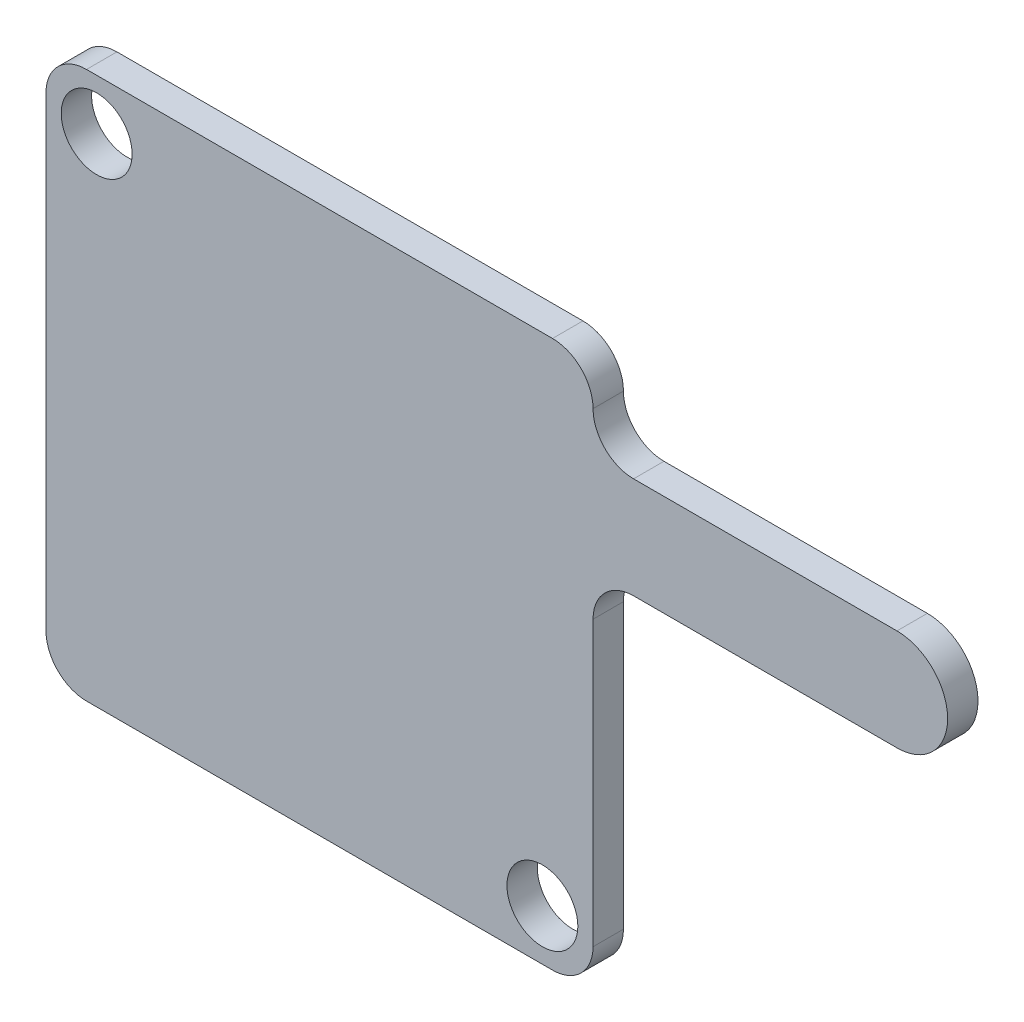
ISO-10303-21;
HEADER;
FILE_DESCRIPTION(('STEP AP214'),'2;1');
FILE_NAME('part.step','',(''),(''),'','','');
FILE_SCHEMA(('AUTOMOTIVE_DESIGN { 1 0 10303 214 1 1 1 1 }'));
ENDSEC;
DATA;
#1=APPLICATION_CONTEXT('core data for automotive mechanical design processes');
#2=APPLICATION_PROTOCOL_DEFINITION('international standard','automotive_design',2000,#1);
#3=PRODUCT_CONTEXT('',#1,'mechanical');
#4=PRODUCT('Part','Part','',(#3));
#5=PRODUCT_RELATED_PRODUCT_CATEGORY('part','',(#4));
#6=PRODUCT_DEFINITION_FORMATION('','',#4);
#7=PRODUCT_DEFINITION_CONTEXT('part definition',#1,'design');
#8=PRODUCT_DEFINITION('design','',#6,#7);
#9=PRODUCT_DEFINITION_SHAPE('','',#8);
#10=(LENGTH_UNIT() NAMED_UNIT(*) SI_UNIT(.MILLI.,.METRE.));
#11=(NAMED_UNIT(*) PLANE_ANGLE_UNIT() SI_UNIT($,.RADIAN.));
#12=(NAMED_UNIT(*) SI_UNIT($,.STERADIAN.) SOLID_ANGLE_UNIT());
#13=UNCERTAINTY_MEASURE_WITH_UNIT(LENGTH_MEASURE(1.E-05),#10,'distance_accuracy_value','');
#14=(GEOMETRIC_REPRESENTATION_CONTEXT(3) GLOBAL_UNCERTAINTY_ASSIGNED_CONTEXT((#13)) GLOBAL_UNIT_ASSIGNED_CONTEXT((#10,
#11,#12)) REPRESENTATION_CONTEXT('',''));
#15=CARTESIAN_POINT('',(0.,0.,0.));
#16=DIRECTION('',(0.,0.,1.));
#17=DIRECTION('',(1.,0.,0.));
#18=AXIS2_PLACEMENT_3D('',#15,#16,#17);
#19=CARTESIAN_POINT('',(42.,20.5,1.5));
#20=DIRECTION('',(0.,0.,-1.));
#21=DIRECTION('',(-1.,0.,0.));
#22=AXIS2_PLACEMENT_3D('',#19,#20,#21);
#23=PLANE('',#22);
#24=CARTESIAN_POINT('',(2.5,24.5,1.5));
#25=DIRECTION('',(0.,0.,1.));
#26=DIRECTION('',(1.,0.,0.));
#27=AXIS2_PLACEMENT_3D('',#24,#25,#26);
#28=CIRCLE('',#27,1.75);
#29=CARTESIAN_POINT('',(4.25,24.5,1.5));
#30=VERTEX_POINT('',#29);
#31=EDGE_CURVE('E163',#30,#30,#28,.T.);
#32=ORIENTED_EDGE('',*,*,#31,.F.);
#33=EDGE_LOOP('',(#32));
#34=FACE_BOUND('',#33,.T.);
#35=DIRECTION('',(0.,-1.,0.));
#36=VECTOR('',#35,1.);
#37=CARTESIAN_POINT('',(0.,0.,1.5));
#38=LINE('',#37,#36);
#39=CARTESIAN_POINT('',(0.,25.,1.5));
#40=VERTEX_POINT('',#39);
#41=CARTESIAN_POINT('',(0.,2.,1.5));
#42=VERTEX_POINT('',#41);
#43=EDGE_CURVE('E241',#40,#42,#38,.T.);
#44=ORIENTED_EDGE('',*,*,#43,.T.);
#45=CARTESIAN_POINT('',(2.,2.,1.5));
#46=DIRECTION('',(0.,0.,-1.));
#47=DIRECTION('',(-1.,0.,0.));
#48=AXIS2_PLACEMENT_3D('',#45,#46,#47);
#49=CIRCLE('',#48,2.);
#50=CARTESIAN_POINT('',(2.,0.,1.5));
#51=VERTEX_POINT('',#50);
#52=EDGE_CURVE('E202',#42,#51,#49,.F.);
#53=ORIENTED_EDGE('',*,*,#52,.T.);
#54=DIRECTION('',(1.,0.,0.));
#55=VECTOR('',#54,1.);
#56=CARTESIAN_POINT('',(0.,0.,1.5));
#57=LINE('',#56,#55);
#58=CARTESIAN_POINT('',(25.,0.,1.5));
#59=VERTEX_POINT('',#58);
#60=EDGE_CURVE('E258',#51,#59,#57,.T.);
#61=ORIENTED_EDGE('',*,*,#60,.T.);
#62=CARTESIAN_POINT('',(25.,2.,1.5));
#63=DIRECTION('',(0.,0.,-1.));
#64=DIRECTION('',(-1.,0.,0.));
#65=AXIS2_PLACEMENT_3D('',#62,#63,#64);
#66=CIRCLE('',#65,2.);
#67=CARTESIAN_POINT('',(27.,2.,1.5));
#68=VERTEX_POINT('',#67);
#69=EDGE_CURVE('E200',#59,#68,#66,.F.);
#70=ORIENTED_EDGE('',*,*,#69,.T.);
#71=DIRECTION('',(0.,1.,0.));
#72=VECTOR('',#71,1.);
#73=CARTESIAN_POINT('',(27.,0.,1.5));
#74=LINE('',#73,#72);
#75=CARTESIAN_POINT('',(27.,16.,1.5));
#76=VERTEX_POINT('',#75);
#77=EDGE_CURVE('E140',#68,#76,#74,.T.);
#78=ORIENTED_EDGE('',*,*,#77,.T.);
#79=CARTESIAN_POINT('',(29.,16.,1.5));
#80=DIRECTION('',(0.,0.,-1.));
#81=DIRECTION('',(-1.,0.,0.));
#82=AXIS2_PLACEMENT_3D('',#79,#80,#81);
#83=CIRCLE('',#82,2.);
#84=CARTESIAN_POINT('',(29.,18.,1.5));
#85=VERTEX_POINT('',#84);
#86=EDGE_CURVE('E59',#76,#85,#83,.T.);
#87=ORIENTED_EDGE('',*,*,#86,.T.);
#88=DIRECTION('',(1.,0.,0.));
#89=VECTOR('',#88,1.);
#90=CARTESIAN_POINT('',(42.,18.,1.5));
#91=LINE('',#90,#89);
#92=CARTESIAN_POINT('',(42.,18.,1.5));
#93=VERTEX_POINT('',#92);
#94=EDGE_CURVE('E130',#85,#93,#91,.T.);
#95=ORIENTED_EDGE('',*,*,#94,.T.);
#96=CARTESIAN_POINT('',(42.,20.5,1.5));
#97=DIRECTION('',(0.,0.,1.));
#98=DIRECTION('',(-1.,0.,0.));
#99=AXIS2_PLACEMENT_3D('',#96,#97,#98);
#100=CIRCLE('',#99,2.5);
#101=CARTESIAN_POINT('',(42.,23.,1.5));
#102=VERTEX_POINT('',#101);
#103=EDGE_CURVE('E135',#93,#102,#100,.T.);
#104=ORIENTED_EDGE('',*,*,#103,.T.);
#105=DIRECTION('',(-1.,0.,0.));
#106=VECTOR('',#105,1.);
#107=CARTESIAN_POINT('',(27.,23.,1.5));
#108=LINE('',#107,#106);
#109=CARTESIAN_POINT('',(29.,23.,1.5));
#110=VERTEX_POINT('',#109);
#111=EDGE_CURVE('E154',#102,#110,#108,.T.);
#112=ORIENTED_EDGE('',*,*,#111,.T.);
#113=CARTESIAN_POINT('',(29.,25.,1.5));
#114=DIRECTION('',(0.,0.,-1.));
#115=DIRECTION('',(-1.,0.,0.));
#116=AXIS2_PLACEMENT_3D('',#113,#114,#115);
#117=CIRCLE('',#116,2.);
#118=CARTESIAN_POINT('',(27.,25.,1.5));
#119=VERTEX_POINT('',#118);
#120=EDGE_CURVE('E11',#110,#119,#117,.T.);
#121=ORIENTED_EDGE('',*,*,#120,.T.);
#122=CARTESIAN_POINT('',(25.,25.,1.5));
#123=DIRECTION('',(0.,0.,-1.));
#124=DIRECTION('',(-1.,0.,0.));
#125=AXIS2_PLACEMENT_3D('',#122,#123,#124);
#126=CIRCLE('',#125,2.);
#127=CARTESIAN_POINT('',(25.,27.,1.5));
#128=VERTEX_POINT('',#127);
#129=EDGE_CURVE('E196',#119,#128,#126,.F.);
#130=ORIENTED_EDGE('',*,*,#129,.T.);
#131=DIRECTION('',(-1.,0.,0.));
#132=VECTOR('',#131,1.);
#133=CARTESIAN_POINT('',(0.,27.,1.5));
#134=LINE('',#133,#132);
#135=CARTESIAN_POINT('',(2.,27.,1.5));
#136=VERTEX_POINT('',#135);
#137=EDGE_CURVE('E177',#128,#136,#134,.T.);
#138=ORIENTED_EDGE('',*,*,#137,.T.);
#139=CARTESIAN_POINT('',(2.,25.,1.5));
#140=DIRECTION('',(0.,0.,-1.));
#141=DIRECTION('',(-1.,0.,0.));
#142=AXIS2_PLACEMENT_3D('',#139,#140,#141);
#143=CIRCLE('',#142,2.);
#144=EDGE_CURVE('E198',#136,#40,#143,.F.);
#145=ORIENTED_EDGE('',*,*,#144,.T.);
#146=EDGE_LOOP('',(#44,#53,#61,#70,#78,#87,#95,#104,#112,#121,#130,#138,#145));
#147=FACE_BOUND('',#146,.T.);
#148=CARTESIAN_POINT('',(24.5,2.5,1.5));
#149=DIRECTION('',(0.,0.,1.));
#150=DIRECTION('',(1.,0.,0.));
#151=AXIS2_PLACEMENT_3D('',#148,#149,#150);
#152=CIRCLE('',#151,1.75);
#153=CARTESIAN_POINT('',(26.25,2.5,1.5));
#154=VERTEX_POINT('',#153);
#155=EDGE_CURVE('E246',#154,#154,#152,.T.);
#156=ORIENTED_EDGE('',*,*,#155,.F.);
#157=EDGE_LOOP('',(#156));
#158=FACE_BOUND('',#157,.T.);
#159=ADVANCED_FACE('F35',(#34,#147,#158),#23,.F.);
#160=CARTESIAN_POINT('',(42.,20.5,0.));
#161=DIRECTION('',(0.,0.,-1.));
#162=DIRECTION('',(-1.,0.,0.));
#163=AXIS2_PLACEMENT_3D('',#160,#161,#162);
#164=PLANE('',#163);
#165=CARTESIAN_POINT('',(2.5,24.5,0.));
#166=DIRECTION('',(0.,0.,1.));
#167=DIRECTION('',(1.,0.,0.));
#168=AXIS2_PLACEMENT_3D('',#165,#166,#167);
#169=CIRCLE('',#168,1.75);
#170=CARTESIAN_POINT('',(4.25,24.5,0.));
#171=VERTEX_POINT('',#170);
#172=EDGE_CURVE('E250',#171,#171,#169,.T.);
#173=ORIENTED_EDGE('',*,*,#172,.T.);
#174=EDGE_LOOP('',(#173));
#175=FACE_BOUND('',#174,.T.);
#176=DIRECTION('',(1.,0.,0.));
#177=VECTOR('',#176,1.);
#178=CARTESIAN_POINT('',(0.,0.,0.));
#179=LINE('',#178,#177);
#180=CARTESIAN_POINT('',(2.,0.,0.));
#181=VERTEX_POINT('',#180);
#182=CARTESIAN_POINT('',(25.,0.,0.));
#183=VERTEX_POINT('',#182);
#184=EDGE_CURVE('E166',#181,#183,#179,.T.);
#185=ORIENTED_EDGE('',*,*,#184,.F.);
#186=CARTESIAN_POINT('',(2.,2.,0.));
#187=DIRECTION('',(0.,0.,-1.));
#188=DIRECTION('',(-1.,0.,0.));
#189=AXIS2_PLACEMENT_3D('',#186,#187,#188);
#190=CIRCLE('',#189,2.);
#191=CARTESIAN_POINT('',(0.,2.,0.));
#192=VERTEX_POINT('',#191);
#193=EDGE_CURVE('E189',#181,#192,#190,.T.);
#194=ORIENTED_EDGE('',*,*,#193,.T.);
#195=DIRECTION('',(0.,-1.,0.));
#196=VECTOR('',#195,1.);
#197=CARTESIAN_POINT('',(0.,0.,0.));
#198=LINE('',#197,#196);
#199=CARTESIAN_POINT('',(0.,25.,0.));
#200=VERTEX_POINT('',#199);
#201=EDGE_CURVE('E162',#200,#192,#198,.T.);
#202=ORIENTED_EDGE('',*,*,#201,.F.);
#203=CARTESIAN_POINT('',(2.,25.,0.));
#204=DIRECTION('',(0.,0.,-1.));
#205=DIRECTION('',(-1.,0.,0.));
#206=AXIS2_PLACEMENT_3D('',#203,#204,#205);
#207=CIRCLE('',#206,2.);
#208=CARTESIAN_POINT('',(2.,27.,0.));
#209=VERTEX_POINT('',#208);
#210=EDGE_CURVE('E185',#200,#209,#207,.T.);
#211=ORIENTED_EDGE('',*,*,#210,.T.);
#212=DIRECTION('',(-1.,0.,0.));
#213=VECTOR('',#212,1.);
#214=CARTESIAN_POINT('',(0.,27.,0.));
#215=LINE('',#214,#213);
#216=CARTESIAN_POINT('',(25.,27.,0.));
#217=VERTEX_POINT('',#216);
#218=EDGE_CURVE('E159',#217,#209,#215,.T.);
#219=ORIENTED_EDGE('',*,*,#218,.F.);
#220=CARTESIAN_POINT('',(25.,25.,0.));
#221=DIRECTION('',(0.,0.,-1.));
#222=DIRECTION('',(-1.,0.,0.));
#223=AXIS2_PLACEMENT_3D('',#220,#221,#222);
#224=CIRCLE('',#223,2.);
#225=CARTESIAN_POINT('',(27.,25.,0.));
#226=VERTEX_POINT('',#225);
#227=EDGE_CURVE('E183',#217,#226,#224,.T.);
#228=ORIENTED_EDGE('',*,*,#227,.T.);
#229=CARTESIAN_POINT('',(29.,25.,0.));
#230=DIRECTION('',(0.,0.,-1.));
#231=DIRECTION('',(-1.,0.,0.));
#232=AXIS2_PLACEMENT_3D('',#229,#230,#231);
#233=CIRCLE('',#232,2.);
#234=CARTESIAN_POINT('',(29.,23.,0.));
#235=VERTEX_POINT('',#234);
#236=EDGE_CURVE('E44',#226,#235,#233,.F.);
#237=ORIENTED_EDGE('',*,*,#236,.T.);
#238=DIRECTION('',(-1.,0.,0.));
#239=VECTOR('',#238,1.);
#240=CARTESIAN_POINT('',(27.,23.,0.));
#241=LINE('',#240,#239);
#242=CARTESIAN_POINT('',(42.,23.,0.));
#243=VERTEX_POINT('',#242);
#244=EDGE_CURVE('E175',#243,#235,#241,.T.);
#245=ORIENTED_EDGE('',*,*,#244,.F.);
#246=CARTESIAN_POINT('',(42.,20.5,0.));
#247=DIRECTION('',(0.,0.,1.));
#248=DIRECTION('',(-1.,0.,0.));
#249=AXIS2_PLACEMENT_3D('',#246,#247,#248);
#250=CIRCLE('',#249,2.5);
#251=CARTESIAN_POINT('',(42.,18.,0.));
#252=VERTEX_POINT('',#251);
#253=EDGE_CURVE('E173',#252,#243,#250,.T.);
#254=ORIENTED_EDGE('',*,*,#253,.F.);
#255=DIRECTION('',(1.,0.,0.));
#256=VECTOR('',#255,1.);
#257=CARTESIAN_POINT('',(42.,18.,0.));
#258=LINE('',#257,#256);
#259=CARTESIAN_POINT('',(29.,18.,0.));
#260=VERTEX_POINT('',#259);
#261=EDGE_CURVE('E146',#260,#252,#258,.T.);
#262=ORIENTED_EDGE('',*,*,#261,.F.);
#263=CARTESIAN_POINT('',(29.,16.,0.));
#264=DIRECTION('',(0.,0.,-1.));
#265=DIRECTION('',(-1.,0.,0.));
#266=AXIS2_PLACEMENT_3D('',#263,#264,#265);
#267=CIRCLE('',#266,2.);
#268=CARTESIAN_POINT('',(27.,16.,0.));
#269=VERTEX_POINT('',#268);
#270=EDGE_CURVE('E217',#260,#269,#267,.F.);
#271=ORIENTED_EDGE('',*,*,#270,.T.);
#272=DIRECTION('',(0.,1.,0.));
#273=VECTOR('',#272,1.);
#274=CARTESIAN_POINT('',(27.,0.,0.));
#275=LINE('',#274,#273);
#276=CARTESIAN_POINT('',(27.,2.,0.));
#277=VERTEX_POINT('',#276);
#278=EDGE_CURVE('E169',#277,#269,#275,.T.);
#279=ORIENTED_EDGE('',*,*,#278,.F.);
#280=CARTESIAN_POINT('',(25.,2.,0.));
#281=DIRECTION('',(0.,0.,-1.));
#282=DIRECTION('',(-1.,0.,0.));
#283=AXIS2_PLACEMENT_3D('',#280,#281,#282);
#284=CIRCLE('',#283,2.);
#285=EDGE_CURVE('E187',#277,#183,#284,.T.);
#286=ORIENTED_EDGE('',*,*,#285,.T.);
#287=EDGE_LOOP('',(#185,#194,#202,#211,#219,#228,#237,#245,#254,#262,#271,#279,#286));
#288=FACE_BOUND('',#287,.T.);
#289=CARTESIAN_POINT('',(24.5,2.5,0.));
#290=DIRECTION('',(0.,0.,1.));
#291=DIRECTION('',(1.,0.,0.));
#292=AXIS2_PLACEMENT_3D('',#289,#290,#291);
#293=CIRCLE('',#292,1.75);
#294=CARTESIAN_POINT('',(26.25,2.5,0.));
#295=VERTEX_POINT('',#294);
#296=EDGE_CURVE('E244',#295,#295,#293,.T.);
#297=ORIENTED_EDGE('',*,*,#296,.T.);
#298=EDGE_LOOP('',(#297));
#299=FACE_BOUND('',#298,.T.);
#300=ADVANCED_FACE('F224',(#175,#288,#299),#164,.T.);
#301=CARTESIAN_POINT('',(0.,27.,1.5));
#302=DIRECTION('',(0.,-1.,0.));
#303=DIRECTION('',(0.,0.,-1.));
#304=AXIS2_PLACEMENT_3D('',#301,#302,#303);
#305=PLANE('',#304);
#306=ORIENTED_EDGE('',*,*,#218,.T.);
#307=DIRECTION('',(0.,0.,-1.));
#308=VECTOR('',#307,1.);
#309=CARTESIAN_POINT('',(2.,27.,1.5));
#310=LINE('',#309,#308);
#311=EDGE_CURVE('E214',#209,#136,#310,.F.);
#312=ORIENTED_EDGE('',*,*,#311,.T.);
#313=ORIENTED_EDGE('',*,*,#137,.F.);
#314=DIRECTION('',(0.,0.,-1.));
#315=VECTOR('',#314,1.);
#316=CARTESIAN_POINT('',(25.,27.,1.5));
#317=LINE('',#316,#315);
#318=EDGE_CURVE('E211',#128,#217,#317,.T.);
#319=ORIENTED_EDGE('',*,*,#318,.T.);
#320=EDGE_LOOP('',(#306,#312,#313,#319));
#321=FACE_BOUND('',#320,.T.);
#322=ADVANCED_FACE('F239',(#321),#305,.F.);
#323=CARTESIAN_POINT('',(0.,0.,1.5));
#324=DIRECTION('',(1.,0.,0.));
#325=DIRECTION('',(0.,0.,-1.));
#326=AXIS2_PLACEMENT_3D('',#323,#324,#325);
#327=PLANE('',#326);
#328=ORIENTED_EDGE('',*,*,#201,.T.);
#329=DIRECTION('',(0.,0.,-1.));
#330=VECTOR('',#329,1.);
#331=CARTESIAN_POINT('',(0.,2.,1.5));
#332=LINE('',#331,#330);
#333=EDGE_CURVE('E194',#192,#42,#332,.F.);
#334=ORIENTED_EDGE('',*,*,#333,.T.);
#335=ORIENTED_EDGE('',*,*,#43,.F.);
#336=DIRECTION('',(0.,0.,-1.));
#337=VECTOR('',#336,1.);
#338=CARTESIAN_POINT('',(0.,25.,1.5));
#339=LINE('',#338,#337);
#340=EDGE_CURVE('E191',#40,#200,#339,.T.);
#341=ORIENTED_EDGE('',*,*,#340,.T.);
#342=EDGE_LOOP('',(#328,#334,#335,#341));
#343=FACE_BOUND('',#342,.T.);
#344=ADVANCED_FACE('F282',(#343),#327,.F.);
#345=CARTESIAN_POINT('',(0.,0.,1.5));
#346=DIRECTION('',(0.,1.,0.));
#347=DIRECTION('',(0.,0.,1.));
#348=AXIS2_PLACEMENT_3D('',#345,#346,#347);
#349=PLANE('',#348);
#350=ORIENTED_EDGE('',*,*,#60,.F.);
#351=DIRECTION('',(0.,0.,-1.));
#352=VECTOR('',#351,1.);
#353=CARTESIAN_POINT('',(2.,0.,1.5));
#354=LINE('',#353,#352);
#355=EDGE_CURVE('E180',#51,#181,#354,.T.);
#356=ORIENTED_EDGE('',*,*,#355,.T.);
#357=ORIENTED_EDGE('',*,*,#184,.T.);
#358=DIRECTION('',(0.,0.,-1.));
#359=VECTOR('',#358,1.);
#360=CARTESIAN_POINT('',(25.,0.,1.5));
#361=LINE('',#360,#359);
#362=EDGE_CURVE('E149',#183,#59,#361,.F.);
#363=ORIENTED_EDGE('',*,*,#362,.T.);
#364=EDGE_LOOP('',(#350,#356,#357,#363));
#365=FACE_BOUND('',#364,.T.);
#366=ADVANCED_FACE('F274',(#365),#349,.F.);
#367=CARTESIAN_POINT('',(27.,0.,1.5));
#368=DIRECTION('',(-1.,0.,0.));
#369=DIRECTION('',(0.,0.,1.));
#370=AXIS2_PLACEMENT_3D('',#367,#368,#369);
#371=PLANE('',#370);
#372=ORIENTED_EDGE('',*,*,#278,.T.);
#373=DIRECTION('',(0.,0.,-1.));
#374=VECTOR('',#373,1.);
#375=CARTESIAN_POINT('',(27.,16.,1.5));
#376=LINE('',#375,#374);
#377=EDGE_CURVE('E209',#269,#76,#376,.F.);
#378=ORIENTED_EDGE('',*,*,#377,.T.);
#379=ORIENTED_EDGE('',*,*,#77,.F.);
#380=DIRECTION('',(0.,0.,-1.));
#381=VECTOR('',#380,1.);
#382=CARTESIAN_POINT('',(27.,2.,1.5));
#383=LINE('',#382,#381);
#384=EDGE_CURVE('E206',#68,#277,#383,.T.);
#385=ORIENTED_EDGE('',*,*,#384,.T.);
#386=EDGE_LOOP('',(#372,#378,#379,#385));
#387=FACE_BOUND('',#386,.T.);
#388=ADVANCED_FACE('F268',(#387),#371,.F.);
#389=CARTESIAN_POINT('',(42.,18.,1.5));
#390=DIRECTION('',(0.,1.,0.));
#391=DIRECTION('',(0.,0.,1.));
#392=AXIS2_PLACEMENT_3D('',#389,#390,#391);
#393=PLANE('',#392);
#394=ORIENTED_EDGE('',*,*,#94,.F.);
#395=DIRECTION('',(0.,0.,-1.));
#396=VECTOR('',#395,1.);
#397=CARTESIAN_POINT('',(29.,18.,0.));
#398=LINE('',#397,#396);
#399=EDGE_CURVE('E204',#85,#260,#398,.T.);
#400=ORIENTED_EDGE('',*,*,#399,.T.);
#401=ORIENTED_EDGE('',*,*,#261,.T.);
#402=DIRECTION('',(0.,0.,-1.));
#403=VECTOR('',#402,1.);
#404=CARTESIAN_POINT('',(42.,18.,1.5));
#405=LINE('',#404,#403);
#406=EDGE_CURVE('E143',#93,#252,#405,.T.);
#407=ORIENTED_EDGE('',*,*,#406,.F.);
#408=EDGE_LOOP('',(#394,#400,#401,#407));
#409=FACE_BOUND('',#408,.T.);
#410=ADVANCED_FACE('F144',(#409),#393,.F.);
#411=CARTESIAN_POINT('',(42.,20.5,1.5));
#412=DIRECTION('',(0.,0.,-1.));
#413=DIRECTION('',(-1.,0.,0.));
#414=AXIS2_PLACEMENT_3D('',#411,#412,#413);
#415=CYLINDRICAL_SURFACE('',#414,2.5);
#416=ORIENTED_EDGE('',*,*,#253,.T.);
#417=DIRECTION('',(0.,0.,-1.));
#418=VECTOR('',#417,1.);
#419=CARTESIAN_POINT('',(42.,23.,1.5));
#420=LINE('',#419,#418);
#421=EDGE_CURVE('E150',#102,#243,#420,.T.);
#422=ORIENTED_EDGE('',*,*,#421,.F.);
#423=ORIENTED_EDGE('',*,*,#103,.F.);
#424=ORIENTED_EDGE('',*,*,#406,.T.);
#425=EDGE_LOOP('',(#416,#422,#423,#424));
#426=FACE_BOUND('',#425,.T.);
#427=ADVANCED_FACE('F152',(#426),#415,.T.);
#428=CARTESIAN_POINT('',(27.,23.,1.5));
#429=DIRECTION('',(0.,-1.,0.));
#430=DIRECTION('',(0.,0.,-1.));
#431=AXIS2_PLACEMENT_3D('',#428,#429,#430);
#432=PLANE('',#431);
#433=ORIENTED_EDGE('',*,*,#244,.T.);
#434=DIRECTION('',(0.,0.,-1.));
#435=VECTOR('',#434,1.);
#436=CARTESIAN_POINT('',(29.,23.,1.5));
#437=LINE('',#436,#435);
#438=EDGE_CURVE('E51',#235,#110,#437,.F.);
#439=ORIENTED_EDGE('',*,*,#438,.T.);
#440=ORIENTED_EDGE('',*,*,#111,.F.);
#441=ORIENTED_EDGE('',*,*,#421,.T.);
#442=EDGE_LOOP('',(#433,#439,#440,#441));
#443=FACE_BOUND('',#442,.T.);
#444=ADVANCED_FACE('F230',(#443),#432,.F.);
#445=CARTESIAN_POINT('',(2.5,24.5,1.5));
#446=DIRECTION('',(0.,0.,-1.));
#447=DIRECTION('',(-1.,0.,0.));
#448=AXIS2_PLACEMENT_3D('',#445,#446,#447);
#449=CYLINDRICAL_SURFACE('',#448,1.75);
#450=ORIENTED_EDGE('',*,*,#31,.T.);
#451=EDGE_LOOP('',(#450));
#452=FACE_BOUND('',#451,.T.);
#453=ORIENTED_EDGE('',*,*,#172,.F.);
#454=EDGE_LOOP('',(#453));
#455=FACE_BOUND('',#454,.T.);
#456=ADVANCED_FACE('F304',(#452,#455),#449,.F.);
#457=CARTESIAN_POINT('',(24.5,2.5,1.5));
#458=DIRECTION('',(0.,0.,-1.));
#459=DIRECTION('',(-1.,0.,0.));
#460=AXIS2_PLACEMENT_3D('',#457,#458,#459);
#461=CYLINDRICAL_SURFACE('',#460,1.75);
#462=ORIENTED_EDGE('',*,*,#155,.T.);
#463=EDGE_LOOP('',(#462));
#464=FACE_BOUND('',#463,.T.);
#465=ORIENTED_EDGE('',*,*,#296,.F.);
#466=EDGE_LOOP('',(#465));
#467=FACE_BOUND('',#466,.T.);
#468=ADVANCED_FACE('F323',(#464,#467),#461,.F.);
#469=CARTESIAN_POINT('',(2.,2.,1.5));
#470=DIRECTION('',(0.,0.,-1.));
#471=DIRECTION('',(-1.,0.,0.));
#472=AXIS2_PLACEMENT_3D('',#469,#470,#471);
#473=CYLINDRICAL_SURFACE('',#472,2.);
#474=ORIENTED_EDGE('',*,*,#52,.F.);
#475=ORIENTED_EDGE('',*,*,#333,.F.);
#476=ORIENTED_EDGE('',*,*,#193,.F.);
#477=ORIENTED_EDGE('',*,*,#355,.F.);
#478=EDGE_LOOP('',(#474,#475,#476,#477));
#479=FACE_BOUND('',#478,.T.);
#480=ADVANCED_FACE('F278',(#479),#473,.T.);
#481=CARTESIAN_POINT('',(29.,16.,1.5));
#482=DIRECTION('',(0.,0.,1.));
#483=DIRECTION('',(1.,0.,0.));
#484=AXIS2_PLACEMENT_3D('',#481,#482,#483);
#485=CYLINDRICAL_SURFACE('',#484,2.);
#486=ORIENTED_EDGE('',*,*,#86,.F.);
#487=ORIENTED_EDGE('',*,*,#377,.F.);
#488=ORIENTED_EDGE('',*,*,#270,.F.);
#489=ORIENTED_EDGE('',*,*,#399,.F.);
#490=EDGE_LOOP('',(#486,#487,#488,#489));
#491=FACE_BOUND('',#490,.T.);
#492=ADVANCED_FACE('F266',(#491),#485,.F.);
#493=CARTESIAN_POINT('',(25.,2.,1.5));
#494=DIRECTION('',(0.,0.,-1.));
#495=DIRECTION('',(-1.,0.,0.));
#496=AXIS2_PLACEMENT_3D('',#493,#494,#495);
#497=CYLINDRICAL_SURFACE('',#496,2.);
#498=ORIENTED_EDGE('',*,*,#69,.F.);
#499=ORIENTED_EDGE('',*,*,#362,.F.);
#500=ORIENTED_EDGE('',*,*,#285,.F.);
#501=ORIENTED_EDGE('',*,*,#384,.F.);
#502=EDGE_LOOP('',(#498,#499,#500,#501));
#503=FACE_BOUND('',#502,.T.);
#504=ADVANCED_FACE('F270',(#503),#497,.T.);
#505=CARTESIAN_POINT('',(2.,25.,1.5));
#506=DIRECTION('',(0.,0.,-1.));
#507=DIRECTION('',(-1.,0.,0.));
#508=AXIS2_PLACEMENT_3D('',#505,#506,#507);
#509=CYLINDRICAL_SURFACE('',#508,2.);
#510=ORIENTED_EDGE('',*,*,#144,.F.);
#511=ORIENTED_EDGE('',*,*,#311,.F.);
#512=ORIENTED_EDGE('',*,*,#210,.F.);
#513=ORIENTED_EDGE('',*,*,#340,.F.);
#514=EDGE_LOOP('',(#510,#511,#512,#513));
#515=FACE_BOUND('',#514,.T.);
#516=ADVANCED_FACE('F286',(#515),#509,.T.);
#517=CARTESIAN_POINT('',(29.,25.,1.5));
#518=DIRECTION('',(0.,0.,1.));
#519=DIRECTION('',(1.,0.,0.));
#520=AXIS2_PLACEMENT_3D('',#517,#518,#519);
#521=CYLINDRICAL_SURFACE('',#520,2.);
#522=DIRECTION('',(0.,0.,-1.));
#523=VECTOR('',#522,1.);
#524=CARTESIAN_POINT('',(27.,25.,0.));
#525=LINE('',#524,#523);
#526=EDGE_CURVE('E39',#119,#226,#525,.T.);
#527=ORIENTED_EDGE('',*,*,#526,.F.);
#528=ORIENTED_EDGE('',*,*,#120,.F.);
#529=ORIENTED_EDGE('',*,*,#438,.F.);
#530=ORIENTED_EDGE('',*,*,#236,.F.);
#531=EDGE_LOOP('',(#527,#528,#529,#530));
#532=FACE_BOUND('',#531,.T.);
#533=ADVANCED_FACE('F37',(#532),#521,.F.);
#534=CARTESIAN_POINT('',(25.,25.,1.5));
#535=DIRECTION('',(0.,0.,-1.));
#536=DIRECTION('',(-1.,0.,0.));
#537=AXIS2_PLACEMENT_3D('',#534,#535,#536);
#538=CYLINDRICAL_SURFACE('',#537,2.);
#539=ORIENTED_EDGE('',*,*,#129,.F.);
#540=ORIENTED_EDGE('',*,*,#526,.T.);
#541=ORIENTED_EDGE('',*,*,#227,.F.);
#542=ORIENTED_EDGE('',*,*,#318,.F.);
#543=EDGE_LOOP('',(#539,#540,#541,#542));
#544=FACE_BOUND('',#543,.T.);
#545=ADVANCED_FACE('F243',(#544),#538,.T.);
#546=CLOSED_SHELL('',(#159,#300,#322,#344,#366,#388,#410,#427,#444,#456,#468,#480,#492,#504,
#516,#533,#545));
#547=MANIFOLD_SOLID_BREP('B2',#546);
#548=ADVANCED_BREP_SHAPE_REPRESENTATION('',(#18,#547),#14);
#549=SHAPE_DEFINITION_REPRESENTATION(#9,#548);
ENDSEC;
END-ISO-10303-21;
